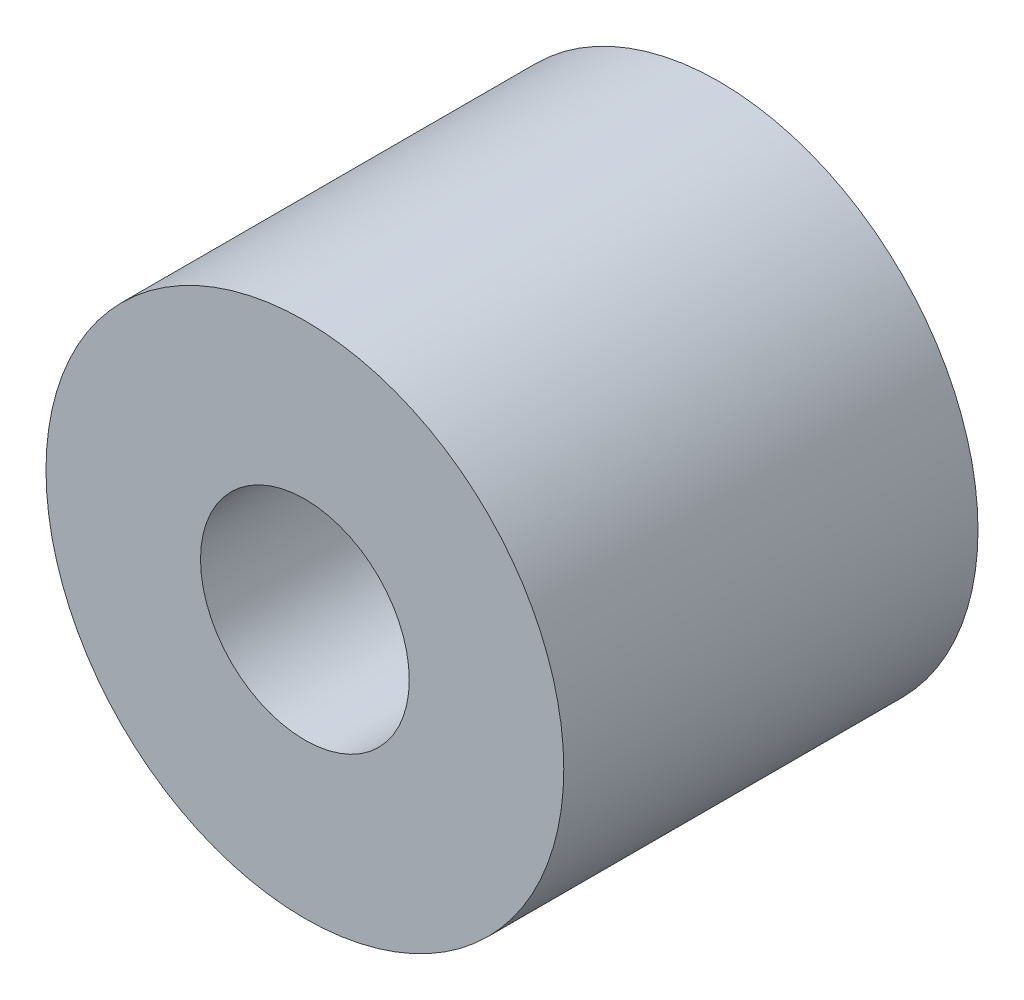
ISO-10303-21;
HEADER;
FILE_DESCRIPTION(('STEP AP214'),'2;1');
FILE_NAME('part.step','',(''),(''),'','','');
FILE_SCHEMA(('AUTOMOTIVE_DESIGN { 1 0 10303 214 1 1 1 1 }'));
ENDSEC;
DATA;
#1=APPLICATION_CONTEXT('core data for automotive mechanical design processes');
#2=APPLICATION_PROTOCOL_DEFINITION('international standard','automotive_design',2000,#1);
#3=PRODUCT_CONTEXT('',#1,'mechanical');
#4=PRODUCT('Part','Part','',(#3));
#5=PRODUCT_RELATED_PRODUCT_CATEGORY('part','',(#4));
#6=PRODUCT_DEFINITION_FORMATION('','',#4);
#7=PRODUCT_DEFINITION_CONTEXT('part definition',#1,'design');
#8=PRODUCT_DEFINITION('design','',#6,#7);
#9=PRODUCT_DEFINITION_SHAPE('','',#8);
#10=(LENGTH_UNIT() NAMED_UNIT(*) SI_UNIT(.MILLI.,.METRE.));
#11=(NAMED_UNIT(*) PLANE_ANGLE_UNIT() SI_UNIT($,.RADIAN.));
#12=(NAMED_UNIT(*) SI_UNIT($,.STERADIAN.) SOLID_ANGLE_UNIT());
#13=UNCERTAINTY_MEASURE_WITH_UNIT(LENGTH_MEASURE(1.E-05),#10,'distance_accuracy_value','');
#14=(GEOMETRIC_REPRESENTATION_CONTEXT(3) GLOBAL_UNCERTAINTY_ASSIGNED_CONTEXT((#13)) GLOBAL_UNIT_ASSIGNED_CONTEXT((#10,
#11,#12)) REPRESENTATION_CONTEXT('',''));
#15=CARTESIAN_POINT('',(0.,0.,0.));
#16=DIRECTION('',(0.,0.,1.));
#17=DIRECTION('',(1.,0.,0.));
#18=AXIS2_PLACEMENT_3D('',#15,#16,#17);
#19=CARTESIAN_POINT('',(0.,0.,6.35));
#20=DIRECTION('',(0.,0.,1.));
#21=DIRECTION('',(1.,0.,0.));
#22=AXIS2_PLACEMENT_3D('',#19,#20,#21);
#23=PLANE('',#22);
#24=CARTESIAN_POINT('',(0.,0.,6.35));
#25=DIRECTION('',(0.,0.,1.));
#26=DIRECTION('',(1.,0.,0.));
#27=AXIS2_PLACEMENT_3D('',#24,#25,#26);
#28=CIRCLE('',#27,7.9375);
#29=CARTESIAN_POINT('',(7.9375,0.,6.35));
#30=VERTEX_POINT('',#29);
#31=EDGE_CURVE('E10',#30,#30,#28,.T.);
#32=ORIENTED_EDGE('',*,*,#31,.T.);
#33=EDGE_LOOP('',(#32));
#34=FACE_BOUND('',#33,.T.);
#35=CARTESIAN_POINT('',(0.,0.,6.35));
#36=DIRECTION('',(0.,0.,1.));
#37=DIRECTION('',(1.,0.,0.));
#38=AXIS2_PLACEMENT_3D('',#35,#36,#37);
#39=CIRCLE('',#38,3.2004);
#40=CARTESIAN_POINT('',(3.2004,0.,6.35));
#41=VERTEX_POINT('',#40);
#42=EDGE_CURVE('E43',#41,#41,#39,.T.);
#43=ORIENTED_EDGE('',*,*,#42,.F.);
#44=EDGE_LOOP('',(#43));
#45=FACE_BOUND('',#44,.T.);
#46=ADVANCED_FACE('F32',(#34,#45),#23,.T.);
#47=CARTESIAN_POINT('',(0.,0.,-6.35));
#48=DIRECTION('',(0.,0.,1.));
#49=DIRECTION('',(1.,0.,0.));
#50=AXIS2_PLACEMENT_3D('',#47,#48,#49);
#51=PLANE('',#50);
#52=CARTESIAN_POINT('',(0.,0.,-6.35));
#53=DIRECTION('',(0.,0.,1.));
#54=DIRECTION('',(1.,0.,0.));
#55=AXIS2_PLACEMENT_3D('',#52,#53,#54);
#56=CIRCLE('',#55,7.9375);
#57=CARTESIAN_POINT('',(7.9375,0.,-6.35));
#58=VERTEX_POINT('',#57);
#59=EDGE_CURVE('E36',#58,#58,#56,.T.);
#60=ORIENTED_EDGE('',*,*,#59,.F.);
#61=EDGE_LOOP('',(#60));
#62=FACE_BOUND('',#61,.T.);
#63=CARTESIAN_POINT('',(0.,0.,-6.35));
#64=DIRECTION('',(0.,0.,1.));
#65=DIRECTION('',(1.,0.,0.));
#66=AXIS2_PLACEMENT_3D('',#63,#64,#65);
#67=CIRCLE('',#66,3.2004);
#68=CARTESIAN_POINT('',(3.2004,0.,-6.35));
#69=VERTEX_POINT('',#68);
#70=EDGE_CURVE('E45',#69,#69,#67,.T.);
#71=ORIENTED_EDGE('',*,*,#70,.T.);
#72=EDGE_LOOP('',(#71));
#73=FACE_BOUND('',#72,.T.);
#74=ADVANCED_FACE('F55',(#62,#73),#51,.F.);
#75=CARTESIAN_POINT('',(0.,0.,6.35));
#76=DIRECTION('',(0.,0.,-1.));
#77=DIRECTION('',(-1.,0.,0.));
#78=AXIS2_PLACEMENT_3D('',#75,#76,#77);
#79=CYLINDRICAL_SURFACE('',#78,7.9375);
#80=ORIENTED_EDGE('',*,*,#31,.F.);
#81=EDGE_LOOP('',(#80));
#82=FACE_BOUND('',#81,.T.);
#83=ORIENTED_EDGE('',*,*,#59,.T.);
#84=EDGE_LOOP('',(#83));
#85=FACE_BOUND('',#84,.T.);
#86=ADVANCED_FACE('F34',(#82,#85),#79,.T.);
#87=CARTESIAN_POINT('',(0.,0.,6.35));
#88=DIRECTION('',(0.,0.,-1.));
#89=DIRECTION('',(-1.,0.,0.));
#90=AXIS2_PLACEMENT_3D('',#87,#88,#89);
#91=CYLINDRICAL_SURFACE('',#90,3.2004);
#92=ORIENTED_EDGE('',*,*,#42,.T.);
#93=EDGE_LOOP('',(#92));
#94=FACE_BOUND('',#93,.T.);
#95=ORIENTED_EDGE('',*,*,#70,.F.);
#96=EDGE_LOOP('',(#95));
#97=FACE_BOUND('',#96,.T.);
#98=ADVANCED_FACE('F51',(#94,#97),#91,.F.);
#99=CLOSED_SHELL('',(#46,#74,#86,#98));
#100=MANIFOLD_SOLID_BREP('B2',#99);
#101=ADVANCED_BREP_SHAPE_REPRESENTATION('',(#18,#100),#14);
#102=SHAPE_DEFINITION_REPRESENTATION(#9,#101);
ENDSEC;
END-ISO-10303-21;
